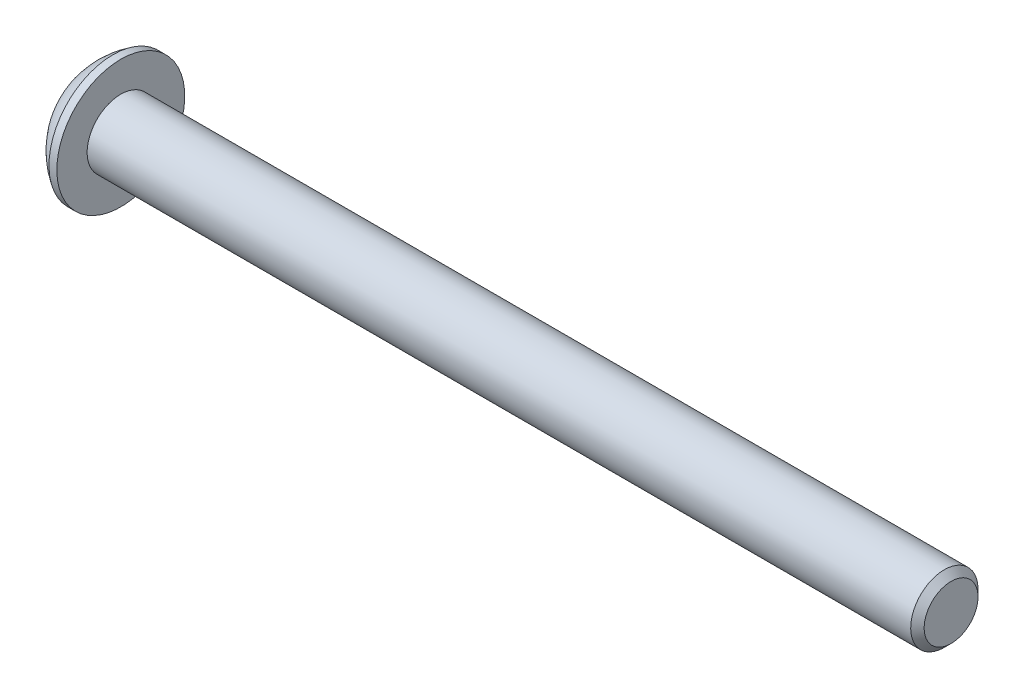
ISO-10303-21;
HEADER;
FILE_DESCRIPTION(('STEP AP214'),'2;1');
FILE_NAME('part.step','',(''),(''),'','','');
FILE_SCHEMA(('AUTOMOTIVE_DESIGN { 1 0 10303 214 1 1 1 1 }'));
ENDSEC;
DATA;
#1=APPLICATION_CONTEXT('core data for automotive mechanical design processes');
#2=APPLICATION_PROTOCOL_DEFINITION('international standard','automotive_design',2000,#1);
#3=PRODUCT_CONTEXT('',#1,'mechanical');
#4=PRODUCT('Part','Part','',(#3));
#5=PRODUCT_RELATED_PRODUCT_CATEGORY('part','',(#4));
#6=PRODUCT_DEFINITION_FORMATION('','',#4);
#7=PRODUCT_DEFINITION_CONTEXT('part definition',#1,'design');
#8=PRODUCT_DEFINITION('design','',#6,#7);
#9=PRODUCT_DEFINITION_SHAPE('','',#8);
#10=(LENGTH_UNIT() NAMED_UNIT(*) SI_UNIT(.MILLI.,.METRE.));
#11=(NAMED_UNIT(*) PLANE_ANGLE_UNIT() SI_UNIT($,.RADIAN.));
#12=(NAMED_UNIT(*) SI_UNIT($,.STERADIAN.) SOLID_ANGLE_UNIT());
#13=UNCERTAINTY_MEASURE_WITH_UNIT(LENGTH_MEASURE(1.E-05),#10,'distance_accuracy_value','');
#14=(GEOMETRIC_REPRESENTATION_CONTEXT(3) GLOBAL_UNCERTAINTY_ASSIGNED_CONTEXT((#13)) GLOBAL_UNIT_ASSIGNED_CONTEXT((#10,
#11,#12)) REPRESENTATION_CONTEXT('',''));
#15=CARTESIAN_POINT('',(0.,0.,0.));
#16=DIRECTION('',(0.,0.,1.));
#17=DIRECTION('',(1.,0.,0.));
#18=AXIS2_PLACEMENT_3D('',#15,#16,#17);
#19=CARTESIAN_POINT('',(38.65,1.5,0.));
#20=DIRECTION('',(1.,0.,0.));
#21=DIRECTION('',(0.,1.,0.));
#22=AXIS2_PLACEMENT_3D('',#19,#20,#21);
#23=PLANE('',#22);
#24=CARTESIAN_POINT('',(38.65,0.,0.));
#25=DIRECTION('',(1.,0.,0.));
#26=DIRECTION('',(0.,1.,0.));
#27=AXIS2_PLACEMENT_3D('',#24,#25,#26);
#28=CIRCLE('',#27,1.2);
#29=CARTESIAN_POINT('',(38.65,1.2,0.));
#30=VERTEX_POINT('',#29);
#31=EDGE_CURVE('E48',#30,#30,#28,.T.);
#32=ORIENTED_EDGE('',*,*,#31,.T.);
#33=EDGE_LOOP('',(#32));
#34=FACE_BOUND('',#33,.T.);
#35=ADVANCED_FACE('F39',(#34),#23,.T.);
#36=CARTESIAN_POINT('',(38.65,0.,0.));
#37=DIRECTION('',(1.,0.,0.));
#38=DIRECTION('',(0.,1.,0.));
#39=AXIS2_PLACEMENT_3D('',#36,#37,#38);
#40=CYLINDRICAL_SURFACE('',#39,1.5);
#41=CARTESIAN_POINT('',(38.35,0.,0.));
#42=DIRECTION('',(1.,0.,0.));
#43=DIRECTION('',(0.,1.,0.));
#44=AXIS2_PLACEMENT_3D('',#41,#42,#43);
#45=CIRCLE('',#44,1.5);
#46=CARTESIAN_POINT('',(38.35,1.5,0.));
#47=VERTEX_POINT('',#46);
#48=EDGE_CURVE('E11',#47,#47,#45,.F.);
#49=ORIENTED_EDGE('',*,*,#48,.T.);
#50=EDGE_LOOP('',(#49));
#51=FACE_BOUND('',#50,.T.);
#52=CARTESIAN_POINT('',(1.65,0.,0.));
#53=DIRECTION('',(1.,0.,0.));
#54=DIRECTION('',(0.,1.,0.));
#55=AXIS2_PLACEMENT_3D('',#52,#53,#54);
#56=CIRCLE('',#55,1.5);
#57=CARTESIAN_POINT('',(1.65,1.5,0.));
#58=VERTEX_POINT('',#57);
#59=EDGE_CURVE('E156',#58,#58,#56,.T.);
#60=ORIENTED_EDGE('',*,*,#59,.T.);
#61=EDGE_LOOP('',(#60));
#62=FACE_BOUND('',#61,.T.);
#63=ADVANCED_FACE('F177',(#51,#62),#40,.T.);
#64=CARTESIAN_POINT('',(1.65,2.85,0.));
#65=DIRECTION('',(1.,0.,0.));
#66=DIRECTION('',(0.,1.,0.));
#67=AXIS2_PLACEMENT_3D('',#64,#65,#66);
#68=PLANE('',#67);
#69=CARTESIAN_POINT('',(1.65,0.,0.));
#70=DIRECTION('',(1.,0.,0.));
#71=DIRECTION('',(0.,1.,0.));
#72=AXIS2_PLACEMENT_3D('',#69,#70,#71);
#73=CIRCLE('',#72,2.85);
#74=CARTESIAN_POINT('',(1.65,2.85,0.));
#75=VERTEX_POINT('',#74);
#76=EDGE_CURVE('E153',#75,#75,#73,.T.);
#77=ORIENTED_EDGE('',*,*,#76,.T.);
#78=EDGE_LOOP('',(#77));
#79=FACE_BOUND('',#78,.T.);
#80=ORIENTED_EDGE('',*,*,#59,.F.);
#81=EDGE_LOOP('',(#80));
#82=FACE_BOUND('',#81,.T.);
#83=ADVANCED_FACE('F181',(#79,#82),#68,.T.);
#84=CARTESIAN_POINT('',(38.65,0.,0.));
#85=DIRECTION('',(1.,0.,0.));
#86=DIRECTION('',(0.,1.,0.));
#87=AXIS2_PLACEMENT_3D('',#84,#85,#86);
#88=CYLINDRICAL_SURFACE('',#87,2.85);
#89=CARTESIAN_POINT('',(1.3,0.,0.));
#90=DIRECTION('',(1.,0.,0.));
#91=DIRECTION('',(0.,1.,0.));
#92=AXIS2_PLACEMENT_3D('',#89,#90,#91);
#93=CIRCLE('',#92,2.85);
#94=CARTESIAN_POINT('',(1.3,2.85,0.));
#95=VERTEX_POINT('',#94);
#96=EDGE_CURVE('E150',#95,#95,#93,.T.);
#97=ORIENTED_EDGE('',*,*,#96,.T.);
#98=EDGE_LOOP('',(#97));
#99=FACE_BOUND('',#98,.T.);
#100=ORIENTED_EDGE('',*,*,#76,.F.);
#101=EDGE_LOOP('',(#100));
#102=FACE_BOUND('',#101,.T.);
#103=ADVANCED_FACE('F187',(#99,#102),#88,.T.);
#104=CARTESIAN_POINT('',(3.13557647887669,0.,0.));
#105=DIRECTION('',(1.,0.,0.));
#106=DIRECTION('',(0.,1.,0.));
#107=AXIS2_PLACEMENT_3D('',#104,#105,#106);
#108=DEGENERATE_TOROIDAL_SURFACE('',#107,0.130043454413821,3.5,.F.);
#109=CARTESIAN_POINT('',(0.,0.,0.));
#110=DIRECTION('',(1.,0.,0.));
#111=DIRECTION('',(0.,1.,0.));
#112=AXIS2_PLACEMENT_3D('',#109,#110,#111);
#113=CIRCLE('',#112,1.425);
#114=CARTESIAN_POINT('',(0.,1.425,0.));
#115=VERTEX_POINT('',#114);
#116=EDGE_CURVE('E142',#115,#115,#113,.T.);
#117=ORIENTED_EDGE('',*,*,#116,.T.);
#118=EDGE_LOOP('',(#117));
#119=FACE_BOUND('',#118,.T.);
#120=ORIENTED_EDGE('',*,*,#96,.F.);
#121=EDGE_LOOP('',(#120));
#122=FACE_BOUND('',#121,.T.);
#123=ADVANCED_FACE('F172',(#119,#122),#108,.F.);
#124=CARTESIAN_POINT('',(0.,0.,0.));
#125=DIRECTION('',(-1.,0.,0.));
#126=DIRECTION('',(0.,-1.,0.));
#127=AXIS2_PLACEMENT_3D('',#124,#125,#126);
#128=PLANE('',#127);
#129=DIRECTION('',(0.,1.,0.));
#130=VECTOR('',#129,1.);
#131=CARTESIAN_POINT('',(0.,-0.577350269189626,1.));
#132=LINE('',#131,#130);
#133=CARTESIAN_POINT('',(0.,-0.577350269189626,1.));
#134=VERTEX_POINT('',#133);
#135=CARTESIAN_POINT('',(0.,0.577350269189626,1.));
#136=VERTEX_POINT('',#135);
#137=EDGE_CURVE('E55',#134,#136,#132,.T.);
#138=ORIENTED_EDGE('',*,*,#137,.F.);
#139=DIRECTION('',(0.,0.5,0.866025403784438));
#140=VECTOR('',#139,1.);
#141=CARTESIAN_POINT('',(0.,-1.15470053837925,0.));
#142=LINE('',#141,#140);
#143=CARTESIAN_POINT('',(0.,-1.15470053837925,0.));
#144=VERTEX_POINT('',#143);
#145=EDGE_CURVE('E138',#144,#134,#142,.T.);
#146=ORIENTED_EDGE('',*,*,#145,.F.);
#147=DIRECTION('',(0.,-0.5,0.866025403784438));
#148=VECTOR('',#147,1.);
#149=CARTESIAN_POINT('',(0.,-0.577350269189625,-1.));
#150=LINE('',#149,#148);
#151=CARTESIAN_POINT('',(0.,-0.577350269189625,-1.));
#152=VERTEX_POINT('',#151);
#153=EDGE_CURVE('E136',#152,#144,#150,.T.);
#154=ORIENTED_EDGE('',*,*,#153,.F.);
#155=DIRECTION('',(0.,-1.,0.));
#156=VECTOR('',#155,1.);
#157=CARTESIAN_POINT('',(0.,0.577350269189626,-1.));
#158=LINE('',#157,#156);
#159=CARTESIAN_POINT('',(0.,0.577350269189626,-1.));
#160=VERTEX_POINT('',#159);
#161=EDGE_CURVE('E103',#160,#152,#158,.T.);
#162=ORIENTED_EDGE('',*,*,#161,.F.);
#163=DIRECTION('',(0.,-0.5,-0.866025403784439));
#164=VECTOR('',#163,1.);
#165=CARTESIAN_POINT('',(0.,1.15470053837925,0.));
#166=LINE('',#165,#164);
#167=CARTESIAN_POINT('',(0.,1.15470053837925,0.));
#168=VERTEX_POINT('',#167);
#169=EDGE_CURVE('E132',#168,#160,#166,.T.);
#170=ORIENTED_EDGE('',*,*,#169,.F.);
#171=DIRECTION('',(0.,0.5,-0.866025403784438));
#172=VECTOR('',#171,1.);
#173=CARTESIAN_POINT('',(0.,0.577350269189626,1.));
#174=LINE('',#173,#172);
#175=EDGE_CURVE('E129',#136,#168,#174,.T.);
#176=ORIENTED_EDGE('',*,*,#175,.F.);
#177=EDGE_LOOP('',(#138,#146,#154,#162,#170,#176));
#178=FACE_BOUND('',#177,.T.);
#179=ORIENTED_EDGE('',*,*,#116,.F.);
#180=EDGE_LOOP('',(#179));
#181=FACE_BOUND('',#180,.T.);
#182=ADVANCED_FACE('F164',(#178,#181),#128,.T.);
#183=CARTESIAN_POINT('',(38.65,0.,0.));
#184=DIRECTION('',(-1.,0.,0.));
#185=DIRECTION('',(0.,-1.,0.));
#186=AXIS2_PLACEMENT_3D('',#183,#184,#185);
#187=CONICAL_SURFACE('',#186,1.2,0.78539816339744);
#188=ORIENTED_EDGE('',*,*,#48,.F.);
#189=EDGE_LOOP('',(#188));
#190=FACE_BOUND('',#189,.T.);
#191=ORIENTED_EDGE('',*,*,#31,.F.);
#192=EDGE_LOOP('',(#191));
#193=FACE_BOUND('',#192,.T.);
#194=ADVANCED_FACE('F42',(#190,#193),#187,.T.);
#195=CARTESIAN_POINT('',(1.,-0.577350269189626,1.));
#196=DIRECTION('',(0.,0.,1.));
#197=DIRECTION('',(1.,0.,0.));
#198=AXIS2_PLACEMENT_3D('',#195,#196,#197);
#199=PLANE('',#198);
#200=ORIENTED_EDGE('',*,*,#137,.T.);
#201=DIRECTION('',(-1.,0.,0.));
#202=VECTOR('',#201,1.);
#203=CARTESIAN_POINT('',(1.,0.577350269189626,1.));
#204=LINE('',#203,#202);
#205=CARTESIAN_POINT('',(1.,0.577350269189626,1.));
#206=VERTEX_POINT('',#205);
#207=EDGE_CURVE('E85',#206,#136,#204,.T.);
#208=ORIENTED_EDGE('',*,*,#207,.F.);
#209=DIRECTION('',(0.,1.,0.));
#210=VECTOR('',#209,1.);
#211=CARTESIAN_POINT('',(1.,-0.577350269189626,1.));
#212=LINE('',#211,#210);
#213=CARTESIAN_POINT('',(1.,-0.577350269189626,1.));
#214=VERTEX_POINT('',#213);
#215=EDGE_CURVE('E140',#214,#206,#212,.T.);
#216=ORIENTED_EDGE('',*,*,#215,.F.);
#217=DIRECTION('',(-1.,0.,0.));
#218=VECTOR('',#217,1.);
#219=CARTESIAN_POINT('',(1.,-0.577350269189626,1.));
#220=LINE('',#219,#218);
#221=EDGE_CURVE('E63',#214,#134,#220,.T.);
#222=ORIENTED_EDGE('',*,*,#221,.T.);
#223=EDGE_LOOP('',(#200,#208,#216,#222));
#224=FACE_BOUND('',#223,.T.);
#225=ADVANCED_FACE('F163',(#224),#199,.F.);
#226=CARTESIAN_POINT('',(1.,-1.15470053837925,0.));
#227=DIRECTION('',(0.,-0.866025403784439,0.5));
#228=DIRECTION('',(0.,-0.5,-0.866025403784439));
#229=AXIS2_PLACEMENT_3D('',#226,#227,#228);
#230=PLANE('',#229);
#231=ORIENTED_EDGE('',*,*,#145,.T.);
#232=ORIENTED_EDGE('',*,*,#221,.F.);
#233=DIRECTION('',(0.,0.5,0.866025403784438));
#234=VECTOR('',#233,1.);
#235=CARTESIAN_POINT('',(1.,-1.15470053837925,0.));
#236=LINE('',#235,#234);
#237=CARTESIAN_POINT('',(1.,-1.15470053837925,0.));
#238=VERTEX_POINT('',#237);
#239=EDGE_CURVE('E115',#238,#214,#236,.T.);
#240=ORIENTED_EDGE('',*,*,#239,.F.);
#241=DIRECTION('',(-1.,0.,0.));
#242=VECTOR('',#241,1.);
#243=CARTESIAN_POINT('',(1.,-1.15470053837925,0.));
#244=LINE('',#243,#242);
#245=EDGE_CURVE('E107',#238,#144,#244,.T.);
#246=ORIENTED_EDGE('',*,*,#245,.T.);
#247=EDGE_LOOP('',(#231,#232,#240,#246));
#248=FACE_BOUND('',#247,.T.);
#249=ADVANCED_FACE('F170',(#248),#230,.F.);
#250=CARTESIAN_POINT('',(1.,-0.577350269189625,-1.));
#251=DIRECTION('',(0.,-0.866025403784438,-0.5));
#252=DIRECTION('',(0.,0.5,-0.866025403784438));
#253=AXIS2_PLACEMENT_3D('',#250,#251,#252);
#254=PLANE('',#253);
#255=ORIENTED_EDGE('',*,*,#153,.T.);
#256=ORIENTED_EDGE('',*,*,#245,.F.);
#257=DIRECTION('',(0.,-0.5,0.866025403784438));
#258=VECTOR('',#257,1.);
#259=CARTESIAN_POINT('',(1.,-0.577350269189625,-1.));
#260=LINE('',#259,#258);
#261=CARTESIAN_POINT('',(1.,-0.577350269189625,-1.));
#262=VERTEX_POINT('',#261);
#263=EDGE_CURVE('E111',#262,#238,#260,.T.);
#264=ORIENTED_EDGE('',*,*,#263,.F.);
#265=DIRECTION('',(-1.,0.,0.));
#266=VECTOR('',#265,1.);
#267=CARTESIAN_POINT('',(1.,-0.577350269189625,-1.));
#268=LINE('',#267,#266);
#269=EDGE_CURVE('E96',#262,#152,#268,.T.);
#270=ORIENTED_EDGE('',*,*,#269,.T.);
#271=EDGE_LOOP('',(#255,#256,#264,#270));
#272=FACE_BOUND('',#271,.T.);
#273=ADVANCED_FACE('F112',(#272),#254,.F.);
#274=CARTESIAN_POINT('',(1.,0.577350269189626,-1.));
#275=DIRECTION('',(0.,0.,-1.));
#276=DIRECTION('',(0.,1.,0.));
#277=AXIS2_PLACEMENT_3D('',#274,#275,#276);
#278=PLANE('',#277);
#279=ORIENTED_EDGE('',*,*,#161,.T.);
#280=ORIENTED_EDGE('',*,*,#269,.F.);
#281=DIRECTION('',(0.,-1.,0.));
#282=VECTOR('',#281,1.);
#283=CARTESIAN_POINT('',(1.,0.577350269189626,-1.));
#284=LINE('',#283,#282);
#285=CARTESIAN_POINT('',(1.,0.577350269189626,-1.));
#286=VERTEX_POINT('',#285);
#287=EDGE_CURVE('E100',#286,#262,#284,.T.);
#288=ORIENTED_EDGE('',*,*,#287,.F.);
#289=DIRECTION('',(-1.,0.,0.));
#290=VECTOR('',#289,1.);
#291=CARTESIAN_POINT('',(1.,0.577350269189626,-1.));
#292=LINE('',#291,#290);
#293=EDGE_CURVE('E108',#286,#160,#292,.T.);
#294=ORIENTED_EDGE('',*,*,#293,.T.);
#295=EDGE_LOOP('',(#279,#280,#288,#294));
#296=FACE_BOUND('',#295,.T.);
#297=ADVANCED_FACE('F98',(#296),#278,.F.);
#298=CARTESIAN_POINT('',(1.,1.15470053837925,0.));
#299=DIRECTION('',(0.,0.866025403784439,-0.5));
#300=DIRECTION('',(0.,0.5,0.866025403784439));
#301=AXIS2_PLACEMENT_3D('',#298,#299,#300);
#302=PLANE('',#301);
#303=ORIENTED_EDGE('',*,*,#169,.T.);
#304=ORIENTED_EDGE('',*,*,#293,.F.);
#305=DIRECTION('',(0.,-0.5,-0.866025403784439));
#306=VECTOR('',#305,1.);
#307=CARTESIAN_POINT('',(1.,1.15470053837925,0.));
#308=LINE('',#307,#306);
#309=CARTESIAN_POINT('',(1.,1.15470053837925,0.));
#310=VERTEX_POINT('',#309);
#311=EDGE_CURVE('E121',#310,#286,#308,.T.);
#312=ORIENTED_EDGE('',*,*,#311,.F.);
#313=DIRECTION('',(-1.,0.,0.));
#314=VECTOR('',#313,1.);
#315=CARTESIAN_POINT('',(1.,1.15470053837925,0.));
#316=LINE('',#315,#314);
#317=EDGE_CURVE('E145',#310,#168,#316,.T.);
#318=ORIENTED_EDGE('',*,*,#317,.T.);
#319=EDGE_LOOP('',(#303,#304,#312,#318));
#320=FACE_BOUND('',#319,.T.);
#321=ADVANCED_FACE('F198',(#320),#302,.F.);
#322=CARTESIAN_POINT('',(1.,0.577350269189626,1.));
#323=DIRECTION('',(0.,0.866025403784439,0.5));
#324=DIRECTION('',(0.,-0.5,0.866025403784438));
#325=AXIS2_PLACEMENT_3D('',#322,#323,#324);
#326=PLANE('',#325);
#327=ORIENTED_EDGE('',*,*,#175,.T.);
#328=ORIENTED_EDGE('',*,*,#317,.F.);
#329=DIRECTION('',(0.,0.5,-0.866025403784438));
#330=VECTOR('',#329,1.);
#331=CARTESIAN_POINT('',(1.,0.577350269189626,1.));
#332=LINE('',#331,#330);
#333=EDGE_CURVE('E123',#206,#310,#332,.T.);
#334=ORIENTED_EDGE('',*,*,#333,.F.);
#335=ORIENTED_EDGE('',*,*,#207,.T.);
#336=EDGE_LOOP('',(#327,#328,#334,#335));
#337=FACE_BOUND('',#336,.T.);
#338=ADVANCED_FACE('F195',(#337),#326,.F.);
#339=CARTESIAN_POINT('',(1.,0.,0.));
#340=DIRECTION('',(-1.,0.,0.));
#341=DIRECTION('',(0.,-1.,0.));
#342=AXIS2_PLACEMENT_3D('',#339,#340,#341);
#343=PLANE('',#342);
#344=ORIENTED_EDGE('',*,*,#215,.T.);
#345=ORIENTED_EDGE('',*,*,#333,.T.);
#346=ORIENTED_EDGE('',*,*,#311,.T.);
#347=ORIENTED_EDGE('',*,*,#287,.T.);
#348=ORIENTED_EDGE('',*,*,#263,.T.);
#349=ORIENTED_EDGE('',*,*,#239,.T.);
#350=EDGE_LOOP('',(#344,#345,#346,#347,#348,#349));
#351=FACE_BOUND('',#350,.T.);
#352=ADVANCED_FACE('F118',(#351),#343,.T.);
#353=CLOSED_SHELL('',(#35,#63,#83,#103,#123,#182,#194,#225,#249,#273,#297,#321,#338,#352));
#354=MANIFOLD_SOLID_BREP('B2',#353);
#355=ADVANCED_BREP_SHAPE_REPRESENTATION('',(#18,#354),#14);
#356=SHAPE_DEFINITION_REPRESENTATION(#9,#355);
ENDSEC;
END-ISO-10303-21;
